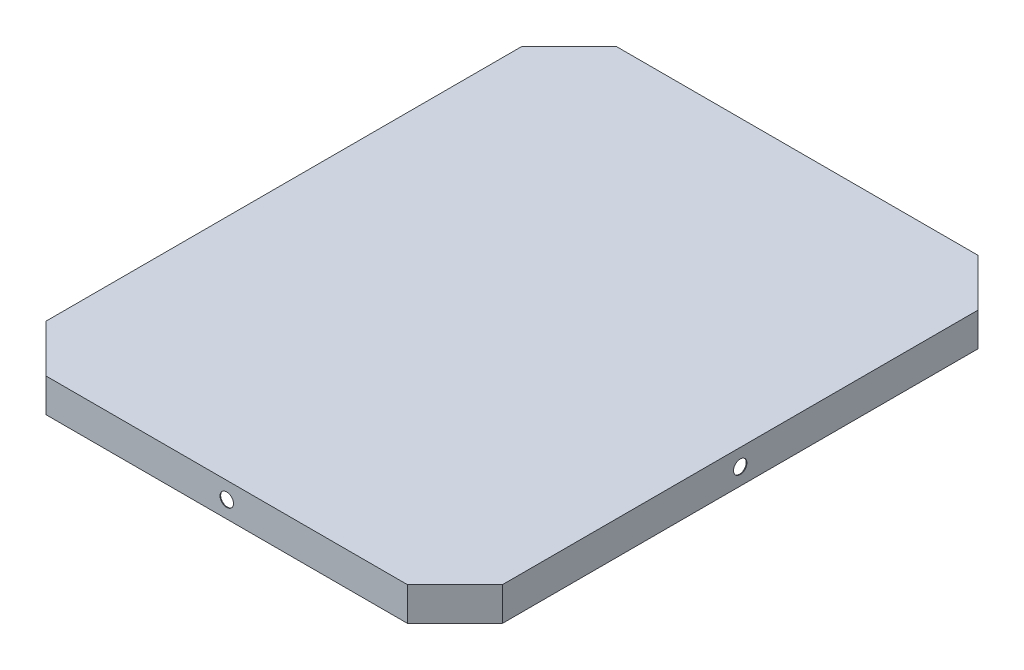
ISO-10303-21;
HEADER;
FILE_DESCRIPTION(('STEP AP214'),'2;1');
FILE_NAME('part.step','',(''),(''),'','','');
FILE_SCHEMA(('AUTOMOTIVE_DESIGN { 1 0 10303 214 1 1 1 1 }'));
ENDSEC;
DATA;
#1=APPLICATION_CONTEXT('core data for automotive mechanical design processes');
#2=APPLICATION_PROTOCOL_DEFINITION('international standard','automotive_design',2000,#1);
#3=PRODUCT_CONTEXT('',#1,'mechanical');
#4=PRODUCT('Part','Part','',(#3));
#5=PRODUCT_RELATED_PRODUCT_CATEGORY('part','',(#4));
#6=PRODUCT_DEFINITION_FORMATION('','',#4);
#7=PRODUCT_DEFINITION_CONTEXT('part definition',#1,'design');
#8=PRODUCT_DEFINITION('design','',#6,#7);
#9=PRODUCT_DEFINITION_SHAPE('','',#8);
#10=(LENGTH_UNIT() NAMED_UNIT(*) SI_UNIT(.MILLI.,.METRE.));
#11=(NAMED_UNIT(*) PLANE_ANGLE_UNIT() SI_UNIT($,.RADIAN.));
#12=(NAMED_UNIT(*) SI_UNIT($,.STERADIAN.) SOLID_ANGLE_UNIT());
#13=UNCERTAINTY_MEASURE_WITH_UNIT(LENGTH_MEASURE(1.E-05),#10,'distance_accuracy_value','');
#14=(GEOMETRIC_REPRESENTATION_CONTEXT(3) GLOBAL_UNCERTAINTY_ASSIGNED_CONTEXT((#13)) GLOBAL_UNIT_ASSIGNED_CONTEXT((#10,
#11,#12)) REPRESENTATION_CONTEXT('',''));
#15=CARTESIAN_POINT('',(0.,0.,0.));
#16=DIRECTION('',(0.,0.,1.));
#17=DIRECTION('',(1.,0.,0.));
#18=AXIS2_PLACEMENT_3D('',#15,#16,#17);
#19=CARTESIAN_POINT('',(581.519515408415,-1.,881.354272588105));
#20=DIRECTION('',(0.7071,0.,0.707113562308064));
#21=DIRECTION('',(0.707113562308064,0.,-0.7071));
#22=AXIS2_PLACEMENT_3D('',#19,#20,#21);
#23=PLANE('',#22);
#24=DIRECTION('',(0.707113562308064,0.,-0.7071));
#25=VECTOR('',#24,1.);
#26=CARTESIAN_POINT('',(278.576496757288,-50.,1184.29148084786));
#27=LINE('',#26,#25);
#28=CARTESIAN_POINT('',(583.519553768783,-50.,879.354272588105));
#29=VERTEX_POINT('',#28);
#30=CARTESIAN_POINT('',(653.645117944282,-50.,809.230053408029));
#31=VERTEX_POINT('',#30);
#32=EDGE_CURVE('E51',#29,#31,#27,.T.);
#33=ORIENTED_EDGE('',*,*,#32,.F.);
#34=DIRECTION('',(0.,1.,0.));
#35=VECTOR('',#34,1.);
#36=CARTESIAN_POINT('',(583.519553768783,-1.,879.354272588105));
#37=LINE('',#36,#35);
#38=CARTESIAN_POINT('',(583.519553768783,-1.,879.354272588105));
#39=VERTEX_POINT('',#38);
#40=EDGE_CURVE('E46',#29,#39,#37,.T.);
#41=ORIENTED_EDGE('',*,*,#40,.T.);
#42=DIRECTION('',(-0.707113562308064,0.,0.7071));
#43=VECTOR('',#42,1.);
#44=CARTESIAN_POINT('',(581.519515408415,-1.,881.354272588105));
#45=LINE('',#44,#43);
#46=CARTESIAN_POINT('',(653.645117944282,-1.,809.230053408029));
#47=VERTEX_POINT('',#46);
#48=EDGE_CURVE('E177',#47,#39,#45,.T.);
#49=ORIENTED_EDGE('',*,*,#48,.F.);
#50=DIRECTION('',(0.,1.,0.));
#51=VECTOR('',#50,1.);
#52=CARTESIAN_POINT('',(653.645117944282,-1.,809.230053408029));
#53=LINE('',#52,#51);
#54=EDGE_CURVE('E173',#31,#47,#53,.T.);
#55=ORIENTED_EDGE('',*,*,#54,.F.);
#56=EDGE_LOOP('',(#33,#41,#49,#55));
#57=FACE_BOUND('',#56,.T.);
#58=ADVANCED_FACE('F30',(#57),#23,.F.);
#59=CARTESIAN_POINT('',(655.645117944282,-1.,103.478518893794));
#60=DIRECTION('',(0.707113562438127,0.,-0.707099999869934));
#61=DIRECTION('',(-0.707099999869934,0.,-0.707113562438127));
#62=AXIS2_PLACEMENT_3D('',#59,#60,#61);
#63=PLANE('',#62);
#64=DIRECTION('',(0.,-1.,0.));
#65=VECTOR('',#64,1.);
#66=CARTESIAN_POINT('',(653.645117944281,-1.,101.47848053269));
#67=LINE('',#66,#65);
#68=CARTESIAN_POINT('',(653.645117944281,-1.,101.47848053269));
#69=VERTEX_POINT('',#68);
#70=CARTESIAN_POINT('',(653.645117944281,-50.,101.47848053269));
#71=VERTEX_POINT('',#70);
#72=EDGE_CURVE('E279',#69,#71,#67,.T.);
#73=ORIENTED_EDGE('',*,*,#72,.F.);
#74=DIRECTION('',(0.707099999869934,0.,0.707113562438127));
#75=VECTOR('',#74,1.);
#76=CARTESIAN_POINT('',(655.645117944282,-1.,103.478518893794));
#77=LINE('',#76,#75);
#78=CARTESIAN_POINT('',(583.520898777104,-1.,31.3529163442925));
#79=VERTEX_POINT('',#78);
#80=EDGE_CURVE('E163',#79,#69,#77,.T.);
#81=ORIENTED_EDGE('',*,*,#80,.F.);
#82=DIRECTION('',(0.,-1.,0.));
#83=VECTOR('',#82,1.);
#84=CARTESIAN_POINT('',(583.520898777104,-1.,31.3529163442925));
#85=LINE('',#84,#83);
#86=CARTESIAN_POINT('',(583.520898777104,-50.,31.3529163442925));
#87=VERTEX_POINT('',#86);
#88=EDGE_CURVE('E153',#79,#87,#85,.T.);
#89=ORIENTED_EDGE('',*,*,#88,.T.);
#90=DIRECTION('',(0.707099999869934,0.,0.707113562438127));
#91=VECTOR('',#90,1.);
#92=CARTESIAN_POINT('',(655.645117944282,-50.,103.478518893794));
#93=LINE('',#92,#91);
#94=EDGE_CURVE('E170',#87,#71,#93,.T.);
#95=ORIENTED_EDGE('',*,*,#94,.T.);
#96=EDGE_LOOP('',(#73,#81,#89,#95));
#97=FACE_BOUND('',#96,.T.);
#98=ADVANCED_FACE('F322',(#97),#63,.F.);
#99=CARTESIAN_POINT('',(314.65094752898,-1.,-237.522191977866));
#100=DIRECTION('',(0.,1.,0.));
#101=DIRECTION('',(0.,0.,1.));
#102=AXIS2_PLACEMENT_3D('',#99,#100,#101);
#103=PLANE('',#102);
#104=ORIENTED_EDGE('',*,*,#48,.T.);
#105=DIRECTION('',(-1.,0.,0.));
#106=VECTOR('',#105,1.);
#107=CARTESIAN_POINT('',(314.65094752898,-1.,879.354272588105));
#108=LINE('',#107,#106);
#109=CARTESIAN_POINT('',(45.7706821327865,-1.,879.354272588105));
#110=VERTEX_POINT('',#109);
#111=EDGE_CURVE('E285',#39,#110,#108,.T.);
#112=ORIENTED_EDGE('',*,*,#111,.T.);
#113=DIRECTION('',(-0.707113562308064,0.,-0.7071));
#114=VECTOR('',#113,1.);
#115=CARTESIAN_POINT('',(-24.3548820427121,-1.,809.230053408029));
#116=LINE('',#115,#114);
#117=CARTESIAN_POINT('',(-24.3548820427121,-1.,809.230053408029));
#118=VERTEX_POINT('',#117);
#119=EDGE_CURVE('E179',#110,#118,#116,.T.);
#120=ORIENTED_EDGE('',*,*,#119,.T.);
#121=DIRECTION('',(0.,0.,-1.));
#122=VECTOR('',#121,1.);
#123=CARTESIAN_POINT('',(-24.3548820427121,-1.,101.477135524369));
#124=LINE('',#123,#122);
#125=CARTESIAN_POINT('',(-24.3548820427121,-1.,101.477135524369));
#126=VERTEX_POINT('',#125);
#127=EDGE_CURVE('E154',#118,#126,#124,.T.);
#128=ORIENTED_EDGE('',*,*,#127,.T.);
#129=DIRECTION('',(0.707113562308064,0.,-0.7071));
#130=VECTOR('',#129,1.);
#131=CARTESIAN_POINT('',(-24.3548820427121,-1.,101.477135524369));
#132=LINE('',#131,#130);
#133=CARTESIAN_POINT('',(45.7706821327867,-1.,31.3529163442924));
#134=VERTEX_POINT('',#133);
#135=EDGE_CURVE('E146',#126,#134,#132,.T.);
#136=ORIENTED_EDGE('',*,*,#135,.T.);
#137=DIRECTION('',(1.,0.,0.));
#138=VECTOR('',#137,1.);
#139=CARTESIAN_POINT('',(583.520898777104,-1.,31.3529163442925));
#140=LINE('',#139,#138);
#141=EDGE_CURVE('E157',#134,#79,#140,.T.);
#142=ORIENTED_EDGE('',*,*,#141,.T.);
#143=ORIENTED_EDGE('',*,*,#80,.T.);
#144=DIRECTION('',(0.,0.,-1.));
#145=VECTOR('',#144,1.);
#146=CARTESIAN_POINT('',(653.645117944281,-1.,-237.522191977866));
#147=LINE('',#146,#145);
#148=EDGE_CURVE('E39',#47,#69,#147,.T.);
#149=ORIENTED_EDGE('',*,*,#148,.F.);
#150=EDGE_LOOP('',(#104,#112,#120,#128,#136,#142,#143,#149));
#151=FACE_BOUND('',#150,.T.);
#152=ADVANCED_FACE('F165',(#151),#103,.F.);
#153=CARTESIAN_POINT('',(-25.3548820427121,-50.,101.062916344292));
#154=DIRECTION('',(-1.,0.,0.));
#155=DIRECTION('',(0.,0.,1.));
#156=AXIS2_PLACEMENT_3D('',#153,#154,#155);
#157=PLANE('',#156);
#158=CARTESIAN_POINT('',(-25.354882042712,-25.,455.354272588105));
#159=DIRECTION('',(-1.,0.,0.));
#160=DIRECTION('',(0.,0.,1.));
#161=AXIS2_PLACEMENT_3D('',#158,#159,#160);
#162=CIRCLE('',#161,9.99999999999998);
#163=CARTESIAN_POINT('',(-25.354882042712,-25.,465.354272588105));
#164=VERTEX_POINT('',#163);
#165=EDGE_CURVE('E193',#164,#164,#162,.T.);
#166=ORIENTED_EDGE('',*,*,#165,.F.);
#167=EDGE_LOOP('',(#166));
#168=FACE_BOUND('',#167,.T.);
#169=DIRECTION('',(0.,0.,1.));
#170=VECTOR('',#169,1.);
#171=CARTESIAN_POINT('',(-25.3548820427121,0.,101.062916344292));
#172=LINE('',#171,#170);
#173=CARTESIAN_POINT('',(-25.3548820427121,0.,101.062916344292));
#174=VERTEX_POINT('',#173);
#175=CARTESIAN_POINT('',(-25.354882042712,0.,809.644272588105));
#176=VERTEX_POINT('',#175);
#177=EDGE_CURVE('E200',#174,#176,#172,.T.);
#178=ORIENTED_EDGE('',*,*,#177,.F.);
#179=DIRECTION('',(0.,1.,0.));
#180=VECTOR('',#179,1.);
#181=CARTESIAN_POINT('',(-25.3548820427121,-50.,101.062916344292));
#182=LINE('',#181,#180);
#183=CARTESIAN_POINT('',(-25.3548820427121,-50.,101.062916344292));
#184=VERTEX_POINT('',#183);
#185=EDGE_CURVE('E247',#184,#174,#182,.T.);
#186=ORIENTED_EDGE('',*,*,#185,.F.);
#187=DIRECTION('',(0.,0.,1.));
#188=VECTOR('',#187,1.);
#189=CARTESIAN_POINT('',(-25.3548820427121,-50.,101.062916344292));
#190=LINE('',#189,#188);
#191=CARTESIAN_POINT('',(-25.354882042712,-50.,809.644272588105));
#192=VERTEX_POINT('',#191);
#193=EDGE_CURVE('E201',#184,#192,#190,.T.);
#194=ORIENTED_EDGE('',*,*,#193,.T.);
#195=DIRECTION('',(0.,1.,0.));
#196=VECTOR('',#195,1.);
#197=CARTESIAN_POINT('',(-25.354882042712,-50.,809.644272588105));
#198=LINE('',#197,#196);
#199=EDGE_CURVE('E224',#192,#176,#198,.T.);
#200=ORIENTED_EDGE('',*,*,#199,.T.);
#201=EDGE_LOOP('',(#178,#186,#194,#200));
#202=FACE_BOUND('',#201,.T.);
#203=ADVANCED_FACE('F32',(#168,#202),#157,.T.);
#204=CARTESIAN_POINT('',(-25.3548820427121,-50.,101.062916344292));
#205=DIRECTION('',(-0.7071,0.,-0.707113562308064));
#206=DIRECTION('',(-0.707113562308064,0.,0.7071));
#207=AXIS2_PLACEMENT_3D('',#204,#205,#206);
#208=PLANE('',#207);
#209=DIRECTION('',(-0.707113562308064,0.,0.7071));
#210=VECTOR('',#209,1.);
#211=CARTESIAN_POINT('',(-25.3548820427121,0.,101.062916344292));
#212=LINE('',#211,#210);
#213=CARTESIAN_POINT('',(45.3564741880943,0.,30.3529163442925));
#214=VERTEX_POINT('',#213);
#215=EDGE_CURVE('E205',#214,#174,#212,.T.);
#216=ORIENTED_EDGE('',*,*,#215,.F.);
#217=DIRECTION('',(0.,1.,0.));
#218=VECTOR('',#217,1.);
#219=CARTESIAN_POINT('',(45.3564741880943,-50.,30.3529163442925));
#220=LINE('',#219,#218);
#221=CARTESIAN_POINT('',(45.3564741880943,-50.,30.3529163442925));
#222=VERTEX_POINT('',#221);
#223=EDGE_CURVE('E250',#222,#214,#220,.T.);
#224=ORIENTED_EDGE('',*,*,#223,.F.);
#225=DIRECTION('',(-0.707113562308064,0.,0.7071));
#226=VECTOR('',#225,1.);
#227=CARTESIAN_POINT('',(-25.3548820427121,-50.,101.062916344292));
#228=LINE('',#227,#226);
#229=EDGE_CURVE('E221',#222,#184,#228,.T.);
#230=ORIENTED_EDGE('',*,*,#229,.T.);
#231=ORIENTED_EDGE('',*,*,#185,.T.);
#232=EDGE_LOOP('',(#216,#224,#230,#231));
#233=FACE_BOUND('',#232,.T.);
#234=ADVANCED_FACE('F355',(#233),#208,.T.);
#235=CARTESIAN_POINT('',(45.3564741880943,-50.,30.3529163442925));
#236=DIRECTION('',(0.,0.,-1.));
#237=DIRECTION('',(-1.,0.,0.));
#238=AXIS2_PLACEMENT_3D('',#235,#236,#237);
#239=PLANE('',#238);
#240=CARTESIAN_POINT('',(314.645117950785,-25.,30.3529163442925));
#241=DIRECTION('',(0.,0.,-1.));
#242=DIRECTION('',(-1.,0.,0.));
#243=AXIS2_PLACEMENT_3D('',#240,#241,#242);
#244=CIRCLE('',#243,9.99999999999998);
#245=CARTESIAN_POINT('',(324.645117950785,-25.,30.3529163442925));
#246=VERTEX_POINT('',#245);
#247=EDGE_CURVE('E196',#246,#246,#244,.T.);
#248=ORIENTED_EDGE('',*,*,#247,.F.);
#249=EDGE_LOOP('',(#248));
#250=FACE_BOUND('',#249,.T.);
#251=DIRECTION('',(-1.,0.,0.));
#252=VECTOR('',#251,1.);
#253=CARTESIAN_POINT('',(45.3564741880943,0.,30.3529163442925));
#254=LINE('',#253,#252);
#255=CARTESIAN_POINT('',(583.935117957288,0.,30.3529163442925));
#256=VERTEX_POINT('',#255);
#257=EDGE_CURVE('E242',#256,#214,#254,.T.);
#258=ORIENTED_EDGE('',*,*,#257,.F.);
#259=DIRECTION('',(0.,1.,0.));
#260=VECTOR('',#259,1.);
#261=CARTESIAN_POINT('',(583.935117957288,-50.,30.3529163442925));
#262=LINE('',#261,#260);
#263=CARTESIAN_POINT('',(583.935117957288,-50.,30.3529163442925));
#264=VERTEX_POINT('',#263);
#265=EDGE_CURVE('E252',#264,#256,#262,.T.);
#266=ORIENTED_EDGE('',*,*,#265,.F.);
#267=DIRECTION('',(-1.,0.,0.));
#268=VECTOR('',#267,1.);
#269=CARTESIAN_POINT('',(45.3564741880943,-50.,30.3529163442925));
#270=LINE('',#269,#268);
#271=EDGE_CURVE('E218',#264,#222,#270,.T.);
#272=ORIENTED_EDGE('',*,*,#271,.T.);
#273=ORIENTED_EDGE('',*,*,#223,.T.);
#274=EDGE_LOOP('',(#258,#266,#272,#273));
#275=FACE_BOUND('',#274,.T.);
#276=ADVANCED_FACE('F358',(#250,#275),#239,.T.);
#277=CARTESIAN_POINT('',(583.935117957288,-50.,30.3529163442925));
#278=DIRECTION('',(0.707113562438127,0.,-0.707099999869934));
#279=DIRECTION('',(-0.707099999869934,0.,-0.707113562438127));
#280=AXIS2_PLACEMENT_3D('',#277,#278,#279);
#281=PLANE('',#280);
#282=DIRECTION('',(-0.707099999869934,0.,-0.707113562438127));
#283=VECTOR('',#282,1.);
#284=CARTESIAN_POINT('',(583.935117957288,0.,30.3529163442925));
#285=LINE('',#284,#283);
#286=CARTESIAN_POINT('',(654.645117944281,0.,101.064272588105));
#287=VERTEX_POINT('',#286);
#288=EDGE_CURVE('E239',#287,#256,#285,.T.);
#289=ORIENTED_EDGE('',*,*,#288,.F.);
#290=DIRECTION('',(0.,1.,0.));
#291=VECTOR('',#290,1.);
#292=CARTESIAN_POINT('',(654.645117944281,-50.,101.064272588105));
#293=LINE('',#292,#291);
#294=CARTESIAN_POINT('',(654.645117944281,-50.,101.064272588105));
#295=VERTEX_POINT('',#294);
#296=EDGE_CURVE('E254',#295,#287,#293,.T.);
#297=ORIENTED_EDGE('',*,*,#296,.F.);
#298=DIRECTION('',(-0.707099999869934,0.,-0.707113562438127));
#299=VECTOR('',#298,1.);
#300=CARTESIAN_POINT('',(583.935117957288,-50.,30.3529163442925));
#301=LINE('',#300,#299);
#302=EDGE_CURVE('E215',#295,#264,#301,.T.);
#303=ORIENTED_EDGE('',*,*,#302,.T.);
#304=ORIENTED_EDGE('',*,*,#265,.T.);
#305=EDGE_LOOP('',(#289,#297,#303,#304));
#306=FACE_BOUND('',#305,.T.);
#307=ADVANCED_FACE('F362',(#306),#281,.T.);
#308=CARTESIAN_POINT('',(654.645117944281,-50.,101.064272588105));
#309=DIRECTION('',(1.,0.,0.));
#310=DIRECTION('',(0.,0.,-1.));
#311=AXIS2_PLACEMENT_3D('',#308,#309,#310);
#312=PLANE('',#311);
#313=CARTESIAN_POINT('',(654.645117944282,-25.,455.354272588105));
#314=DIRECTION('',(1.,0.,0.));
#315=DIRECTION('',(0.,0.,-1.));
#316=AXIS2_PLACEMENT_3D('',#313,#314,#315);
#317=CIRCLE('',#316,9.99999999999998);
#318=CARTESIAN_POINT('',(654.645117944282,-25.,445.354272588105));
#319=VERTEX_POINT('',#318);
#320=EDGE_CURVE('E275',#319,#319,#317,.T.);
#321=ORIENTED_EDGE('',*,*,#320,.F.);
#322=EDGE_LOOP('',(#321));
#323=FACE_BOUND('',#322,.T.);
#324=DIRECTION('',(0.,0.,-1.));
#325=VECTOR('',#324,1.);
#326=CARTESIAN_POINT('',(654.645117944281,-50.,101.064272588105));
#327=LINE('',#326,#325);
#328=CARTESIAN_POINT('',(654.645117944282,-50.,809.644272588105));
#329=VERTEX_POINT('',#328);
#330=EDGE_CURVE('E213',#329,#295,#327,.T.);
#331=ORIENTED_EDGE('',*,*,#330,.T.);
#332=ORIENTED_EDGE('',*,*,#296,.T.);
#333=DIRECTION('',(0.,0.,-1.));
#334=VECTOR('',#333,1.);
#335=CARTESIAN_POINT('',(654.645117944281,0.,101.064272588105));
#336=LINE('',#335,#334);
#337=CARTESIAN_POINT('',(654.645117944282,0.,809.644272588105));
#338=VERTEX_POINT('',#337);
#339=EDGE_CURVE('E236',#338,#287,#336,.T.);
#340=ORIENTED_EDGE('',*,*,#339,.F.);
#341=DIRECTION('',(0.,1.,0.));
#342=VECTOR('',#341,1.);
#343=CARTESIAN_POINT('',(654.645117944282,-50.,809.644272588105));
#344=LINE('',#343,#342);
#345=EDGE_CURVE('E256',#329,#338,#344,.T.);
#346=ORIENTED_EDGE('',*,*,#345,.F.);
#347=EDGE_LOOP('',(#331,#332,#340,#346));
#348=FACE_BOUND('',#347,.T.);
#349=ADVANCED_FACE('F366',(#323,#348),#312,.T.);
#350=CARTESIAN_POINT('',(654.645117944282,-50.,809.644272588105));
#351=DIRECTION('',(0.7071,0.,0.707113562308064));
#352=DIRECTION('',(0.707113562308064,0.,-0.7071));
#353=AXIS2_PLACEMENT_3D('',#350,#351,#352);
#354=PLANE('',#353);
#355=DIRECTION('',(0.707113562308064,0.,-0.7071));
#356=VECTOR('',#355,1.);
#357=CARTESIAN_POINT('',(654.645117944282,0.,809.644272588105));
#358=LINE('',#357,#356);
#359=CARTESIAN_POINT('',(583.933761713475,0.,880.354272588105));
#360=VERTEX_POINT('',#359);
#361=EDGE_CURVE('E233',#360,#338,#358,.T.);
#362=ORIENTED_EDGE('',*,*,#361,.F.);
#363=DIRECTION('',(0.,1.,0.));
#364=VECTOR('',#363,1.);
#365=CARTESIAN_POINT('',(583.933761713475,-50.,880.354272588105));
#366=LINE('',#365,#364);
#367=CARTESIAN_POINT('',(583.933761713475,-50.,880.354272588105));
#368=VERTEX_POINT('',#367);
#369=EDGE_CURVE('E258',#368,#360,#366,.T.);
#370=ORIENTED_EDGE('',*,*,#369,.F.);
#371=DIRECTION('',(0.707113562308064,0.,-0.7071));
#372=VECTOR('',#371,1.);
#373=CARTESIAN_POINT('',(654.645117944282,-50.,809.644272588105));
#374=LINE('',#373,#372);
#375=EDGE_CURVE('E210',#368,#329,#374,.T.);
#376=ORIENTED_EDGE('',*,*,#375,.T.);
#377=ORIENTED_EDGE('',*,*,#345,.T.);
#378=EDGE_LOOP('',(#362,#370,#376,#377));
#379=FACE_BOUND('',#378,.T.);
#380=ADVANCED_FACE('F370',(#379),#354,.T.);
#381=CARTESIAN_POINT('',(45.3564741880943,-50.,880.354272588105));
#382=DIRECTION('',(0.,0.,1.));
#383=DIRECTION('',(1.,0.,0.));
#384=AXIS2_PLACEMENT_3D('',#381,#382,#383);
#385=PLANE('',#384);
#386=CARTESIAN_POINT('',(314.645117950785,-25.,880.354272588105));
#387=DIRECTION('',(0.,0.,1.));
#388=DIRECTION('',(1.,0.,0.));
#389=AXIS2_PLACEMENT_3D('',#386,#387,#388);
#390=CIRCLE('',#389,9.99999999999998);
#391=CARTESIAN_POINT('',(324.645117950785,-25.,880.354272588105));
#392=VERTEX_POINT('',#391);
#393=EDGE_CURVE('E303',#392,#392,#390,.T.);
#394=ORIENTED_EDGE('',*,*,#393,.F.);
#395=EDGE_LOOP('',(#394));
#396=FACE_BOUND('',#395,.T.);
#397=DIRECTION('',(1.,0.,0.));
#398=VECTOR('',#397,1.);
#399=CARTESIAN_POINT('',(45.3564741880943,-50.,880.354272588105));
#400=LINE('',#399,#398);
#401=CARTESIAN_POINT('',(45.3564741880943,-50.,880.354272588105));
#402=VERTEX_POINT('',#401);
#403=EDGE_CURVE('E208',#402,#368,#400,.T.);
#404=ORIENTED_EDGE('',*,*,#403,.T.);
#405=ORIENTED_EDGE('',*,*,#369,.T.);
#406=DIRECTION('',(1.,0.,0.));
#407=VECTOR('',#406,1.);
#408=CARTESIAN_POINT('',(45.3564741880943,0.,880.354272588105));
#409=LINE('',#408,#407);
#410=CARTESIAN_POINT('',(45.3564741880943,0.,880.354272588105));
#411=VERTEX_POINT('',#410);
#412=EDGE_CURVE('E230',#411,#360,#409,.T.);
#413=ORIENTED_EDGE('',*,*,#412,.F.);
#414=DIRECTION('',(0.,1.,0.));
#415=VECTOR('',#414,1.);
#416=CARTESIAN_POINT('',(45.3564741880943,-50.,880.354272588105));
#417=LINE('',#416,#415);
#418=EDGE_CURVE('E260',#402,#411,#417,.T.);
#419=ORIENTED_EDGE('',*,*,#418,.F.);
#420=EDGE_LOOP('',(#404,#405,#413,#419));
#421=FACE_BOUND('',#420,.T.);
#422=ADVANCED_FACE('F374',(#396,#421),#385,.T.);
#423=CARTESIAN_POINT('',(-25.354882042712,-50.,809.644272588105));
#424=DIRECTION('',(-0.707100000000001,0.,0.707113562308063));
#425=DIRECTION('',(0.707113562308063,0.,0.707100000000001));
#426=AXIS2_PLACEMENT_3D('',#423,#424,#425);
#427=PLANE('',#426);
#428=DIRECTION('',(0.707113562308063,0.,0.707100000000001));
#429=VECTOR('',#428,1.);
#430=CARTESIAN_POINT('',(-25.354882042712,0.,809.644272588105));
#431=LINE('',#430,#429);
#432=EDGE_CURVE('E227',#176,#411,#431,.T.);
#433=ORIENTED_EDGE('',*,*,#432,.F.);
#434=ORIENTED_EDGE('',*,*,#199,.F.);
#435=DIRECTION('',(0.707113562308063,0.,0.707100000000001));
#436=VECTOR('',#435,1.);
#437=CARTESIAN_POINT('',(-25.354882042712,-50.,809.644272588105));
#438=LINE('',#437,#436);
#439=EDGE_CURVE('E204',#192,#402,#438,.T.);
#440=ORIENTED_EDGE('',*,*,#439,.T.);
#441=ORIENTED_EDGE('',*,*,#418,.T.);
#442=EDGE_LOOP('',(#433,#434,#440,#441));
#443=FACE_BOUND('',#442,.T.);
#444=ADVANCED_FACE('F350',(#443),#427,.T.);
#445=CARTESIAN_POINT('',(-25.354882042712,-50.,880.354272588105));
#446=DIRECTION('',(0.,1.,0.));
#447=DIRECTION('',(0.,0.,1.));
#448=AXIS2_PLACEMENT_3D('',#445,#446,#447);
#449=PLANE('',#448);
#450=DIRECTION('',(1.,0.,0.));
#451=VECTOR('',#450,1.);
#452=CARTESIAN_POINT('',(583.933761713475,-50.,879.354272588105));
#453=LINE('',#452,#451);
#454=CARTESIAN_POINT('',(45.7706821327866,-50.,879.354272588105));
#455=VERTEX_POINT('',#454);
#456=EDGE_CURVE('E300',#455,#29,#453,.T.);
#457=ORIENTED_EDGE('',*,*,#456,.T.);
#458=ORIENTED_EDGE('',*,*,#32,.T.);
#459=DIRECTION('',(0.,0.,-1.));
#460=VECTOR('',#459,1.);
#461=CARTESIAN_POINT('',(653.645117944282,-50.,809.644272588105));
#462=LINE('',#461,#460);
#463=EDGE_CURVE('E274',#31,#71,#462,.T.);
#464=ORIENTED_EDGE('',*,*,#463,.T.);
#465=ORIENTED_EDGE('',*,*,#94,.F.);
#466=DIRECTION('',(1.,0.,0.));
#467=VECTOR('',#466,1.);
#468=CARTESIAN_POINT('',(583.520898777104,-50.,31.3529163442925));
#469=LINE('',#468,#467);
#470=CARTESIAN_POINT('',(45.7706821327867,-50.,31.3529163442924));
#471=VERTEX_POINT('',#470);
#472=EDGE_CURVE('E183',#471,#87,#469,.T.);
#473=ORIENTED_EDGE('',*,*,#472,.F.);
#474=DIRECTION('',(0.707113562308064,0.,-0.7071));
#475=VECTOR('',#474,1.);
#476=CARTESIAN_POINT('',(-24.3548820427121,-50.,101.477135524369));
#477=LINE('',#476,#475);
#478=CARTESIAN_POINT('',(-24.3548820427121,-50.,101.477135524369));
#479=VERTEX_POINT('',#478);
#480=EDGE_CURVE('E149',#479,#471,#477,.T.);
#481=ORIENTED_EDGE('',*,*,#480,.F.);
#482=DIRECTION('',(0.,0.,-1.));
#483=VECTOR('',#482,1.);
#484=CARTESIAN_POINT('',(-24.3548820427121,-50.,101.477135524369));
#485=LINE('',#484,#483);
#486=CARTESIAN_POINT('',(-24.3548820427121,-50.,809.230053408029));
#487=VERTEX_POINT('',#486);
#488=EDGE_CURVE('E167',#487,#479,#485,.T.);
#489=ORIENTED_EDGE('',*,*,#488,.F.);
#490=DIRECTION('',(0.707113562308064,0.,0.7071));
#491=VECTOR('',#490,1.);
#492=CARTESIAN_POINT('',(10.7072179507849,-50.,844.291480916897));
#493=LINE('',#492,#491);
#494=EDGE_CURVE('E249',#487,#455,#493,.T.);
#495=ORIENTED_EDGE('',*,*,#494,.T.);
#496=EDGE_LOOP('',(#457,#458,#464,#465,#473,#481,#489,#495));
#497=FACE_BOUND('',#496,.T.);
#498=ORIENTED_EDGE('',*,*,#403,.F.);
#499=ORIENTED_EDGE('',*,*,#439,.F.);
#500=ORIENTED_EDGE('',*,*,#193,.F.);
#501=ORIENTED_EDGE('',*,*,#229,.F.);
#502=ORIENTED_EDGE('',*,*,#271,.F.);
#503=ORIENTED_EDGE('',*,*,#302,.F.);
#504=ORIENTED_EDGE('',*,*,#330,.F.);
#505=ORIENTED_EDGE('',*,*,#375,.F.);
#506=EDGE_LOOP('',(#498,#499,#500,#501,#502,#503,#504,#505));
#507=FACE_BOUND('',#506,.T.);
#508=ADVANCED_FACE('F347',(#497,#507),#449,.F.);
#509=CARTESIAN_POINT('',(-25.354882042712,0.,880.354272588105));
#510=DIRECTION('',(0.,1.,0.));
#511=DIRECTION('',(0.,0.,1.));
#512=AXIS2_PLACEMENT_3D('',#509,#510,#511);
#513=PLANE('',#512);
#514=ORIENTED_EDGE('',*,*,#432,.T.);
#515=ORIENTED_EDGE('',*,*,#412,.T.);
#516=ORIENTED_EDGE('',*,*,#361,.T.);
#517=ORIENTED_EDGE('',*,*,#339,.T.);
#518=ORIENTED_EDGE('',*,*,#288,.T.);
#519=ORIENTED_EDGE('',*,*,#257,.T.);
#520=ORIENTED_EDGE('',*,*,#215,.T.);
#521=ORIENTED_EDGE('',*,*,#177,.T.);
#522=EDGE_LOOP('',(#514,#515,#516,#517,#518,#519,#520,#521));
#523=FACE_BOUND('',#522,.T.);
#524=ADVANCED_FACE('F345',(#523),#513,.T.);
#525=CARTESIAN_POINT('',(314.645117950785,-25.,25.3542725881053));
#526=DIRECTION('',(0.,0.,1.));
#527=DIRECTION('',(1.,0.,0.));
#528=AXIS2_PLACEMENT_3D('',#525,#526,#527);
#529=CYLINDRICAL_SURFACE('',#528,9.99999999999998);
#530=CARTESIAN_POINT('',(314.645117950785,-25.,31.3529163442925));
#531=DIRECTION('',(0.,0.,-1.));
#532=DIRECTION('',(-1.,0.,0.));
#533=AXIS2_PLACEMENT_3D('',#530,#531,#532);
#534=CIRCLE('',#533,9.99999999999998);
#535=CARTESIAN_POINT('',(324.645117950785,-25.,31.3529163442925));
#536=VERTEX_POINT('',#535);
#537=EDGE_CURVE('E197',#536,#536,#534,.F.);
#538=CARTESIAN_POINT('',(324.645117950785,-25.,31.3529163442925));
#539=CARTESIAN_POINT('',(324.645117950785,-25.,31.3424996776258));
#540=CARTESIAN_POINT('',(324.645117950785,-25.,31.3320830109591));
#541=CARTESIAN_POINT('',(324.645117950785,-25.,31.3112496776258));
#542=CARTESIAN_POINT('',(324.645117950785,-25.,31.3008330109591));
#543=CARTESIAN_POINT('',(324.645117950785,-25.,31.2799996776258));
#544=CARTESIAN_POINT('',(324.645117950785,-25.,31.2695830109591));
#545=CARTESIAN_POINT('',(324.645117950785,-25.,31.2487496776258));
#546=CARTESIAN_POINT('',(324.645117950785,-25.,31.2383330109591));
#547=CARTESIAN_POINT('',(324.645117950785,-25.,31.2174996776258));
#548=CARTESIAN_POINT('',(324.645117950785,-25.,31.2070830109591));
#549=CARTESIAN_POINT('',(324.645117950785,-25.,31.1862496776258));
#550=CARTESIAN_POINT('',(324.645117950785,-25.,31.1758330109591));
#551=CARTESIAN_POINT('',(324.645117950785,-25.,31.1549996776258));
#552=CARTESIAN_POINT('',(324.645117950785,-25.,31.1445830109591));
#553=CARTESIAN_POINT('',(324.645117950785,-25.,31.1237496776258));
#554=CARTESIAN_POINT('',(324.645117950785,-25.,31.1133330109591));
#555=CARTESIAN_POINT('',(324.645117950785,-25.,31.0924996776258));
#556=CARTESIAN_POINT('',(324.645117950785,-25.,31.0820830109591));
#557=CARTESIAN_POINT('',(324.645117950785,-25.,31.0612496776258));
#558=CARTESIAN_POINT('',(324.645117950785,-25.,31.0508330109591));
#559=CARTESIAN_POINT('',(324.645117950785,-25.,31.0299996776258));
#560=CARTESIAN_POINT('',(324.645117950785,-25.,31.0195830109591));
#561=CARTESIAN_POINT('',(324.645117950785,-25.,30.9987496776258));
#562=CARTESIAN_POINT('',(324.645117950785,-25.,30.9883330109591));
#563=CARTESIAN_POINT('',(324.645117950785,-25.,30.9674996776258));
#564=CARTESIAN_POINT('',(324.645117950785,-25.,30.9570830109591));
#565=CARTESIAN_POINT('',(324.645117950785,-25.,30.9362496776258));
#566=CARTESIAN_POINT('',(324.645117950785,-25.,30.9258330109591));
#567=CARTESIAN_POINT('',(324.645117950785,-25.,30.9049996776258));
#568=CARTESIAN_POINT('',(324.645117950785,-25.,30.8945830109592));
#569=CARTESIAN_POINT('',(324.645117950785,-25.,30.8737496776258));
#570=CARTESIAN_POINT('',(324.645117950785,-25.,30.8633330109592));
#571=CARTESIAN_POINT('',(324.645117950785,-25.,30.8424996776258));
#572=CARTESIAN_POINT('',(324.645117950785,-25.,30.8320830109592));
#573=CARTESIAN_POINT('',(324.645117950785,-25.,30.8112496776258));
#574=CARTESIAN_POINT('',(324.645117950785,-25.,30.8008330109592));
#575=CARTESIAN_POINT('',(324.645117950785,-25.,30.7799996776258));
#576=CARTESIAN_POINT('',(324.645117950785,-25.,30.7695830109592));
#577=CARTESIAN_POINT('',(324.645117950785,-25.,30.7487496776258));
#578=CARTESIAN_POINT('',(324.645117950785,-25.,30.7383330109592));
#579=CARTESIAN_POINT('',(324.645117950785,-25.,30.7174996776258));
#580=CARTESIAN_POINT('',(324.645117950785,-25.,30.7070830109592));
#581=CARTESIAN_POINT('',(324.645117950785,-25.,30.6862496776258));
#582=CARTESIAN_POINT('',(324.645117950785,-25.,30.6758330109592));
#583=CARTESIAN_POINT('',(324.645117950785,-25.,30.6549996776258));
#584=CARTESIAN_POINT('',(324.645117950785,-25.,30.6445830109592));
#585=CARTESIAN_POINT('',(324.645117950785,-25.,30.6237496776258));
#586=CARTESIAN_POINT('',(324.645117950785,-25.,30.6133330109592));
#587=CARTESIAN_POINT('',(324.645117950785,-25.,30.5924996776258));
#588=CARTESIAN_POINT('',(324.645117950785,-25.,30.5820830109592));
#589=CARTESIAN_POINT('',(324.645117950785,-25.,30.5612496776258));
#590=CARTESIAN_POINT('',(324.645117950785,-25.,30.5508330109592));
#591=CARTESIAN_POINT('',(324.645117950785,-25.,30.5299996776258));
#592=CARTESIAN_POINT('',(324.645117950785,-25.,30.5195830109592));
#593=CARTESIAN_POINT('',(324.645117950785,-25.,30.4987496776258));
#594=CARTESIAN_POINT('',(324.645117950785,-25.,30.4883330109592));
#595=CARTESIAN_POINT('',(324.645117950785,-25.,30.4674996776258));
#596=CARTESIAN_POINT('',(324.645117950785,-25.,30.4570830109592));
#597=CARTESIAN_POINT('',(324.645117950785,-25.,30.4362496776258));
#598=CARTESIAN_POINT('',(324.645117950785,-25.,30.4258330109592));
#599=CARTESIAN_POINT('',(324.645117950785,-25.,30.4049996776258));
#600=CARTESIAN_POINT('',(324.645117950785,-25.,30.3945830109592));
#601=CARTESIAN_POINT('',(324.645117950785,-25.,30.3737496776258));
#602=CARTESIAN_POINT('',(324.645117950785,-25.,30.3633330109592));
#603=CARTESIAN_POINT('',(324.645117950785,-25.,30.3529163442925));
#604=B_SPLINE_CURVE_WITH_KNOTS('',3,(#538,#539,#540,#541,#542,#543,#544,#545,#546,#547,#548,
#549,#550,#551,#552,#553,#554,#555,#556,#557,#558,#559,#560,#561,#562,#563,#564,#565,#566,#567,
#568,#569,#570,#571,#572,#573,#574,#575,#576,#577,#578,#579,#580,#581,#582,#583,#584,#585,#586,
#587,#588,#589,#590,#591,#592,#593,#594,#595,#596,#597,#598,#599,#600,#601,#602,#603),
.UNSPECIFIED.,.F.,.F.,(4,2,2,2,2,2,2,2,2,2,2,2,2,2,2,2,2,2,2,2,2,2,2,2,2,2,2,2,2,2,2,2,4),(0.,
0.0312499999999966,0.0624999999999931,0.0937499999999966,0.124999999999993,0.156249999999993,
0.187499999999993,0.21874999999999,0.24999999999999,0.28124999999999,0.312499999999986,
0.343749999999986,0.374999999999986,0.406249999999986,0.437499999999987,0.468749999999983,
0.499999999999983,0.531249999999983,0.56249999999998,0.59374999999998,0.62499999999998,
0.65624999999998,0.68749999999998,0.718749999999976,0.749999999999976,0.781249999999976,
0.812499999999973,0.843749999999973,0.874999999999973,0.90624999999997,0.93749999999997,
0.96874999999997,0.99999999999997),.UNSPECIFIED.);
#605=EDGE_CURVE('BSEAM341',#536,#246,#604,.T.);
#606=ORIENTED_EDGE('',*,*,#537,.T.);
#607=ORIENTED_EDGE('',*,*,#247,.T.);
#608=ORIENTED_EDGE('',*,*,#605,.T.);
#609=ORIENTED_EDGE('',*,*,#605,.F.);
#610=EDGE_LOOP('',(#606,#608,#607,#609));
#611=FACE_BOUND('',#610,.T.);
#612=ADVANCED_FACE('F341',(#611),#529,.F.);
#613=CARTESIAN_POINT('',(-195.354882055718,-25.,455.354272588105));
#614=DIRECTION('',(1.,0.,0.));
#615=DIRECTION('',(0.,0.,-1.));
#616=AXIS2_PLACEMENT_3D('',#613,#614,#615);
#617=CYLINDRICAL_SURFACE('',#616,9.99999999999998);
#618=CARTESIAN_POINT('',(-24.3548820427121,-25.,455.354272588105));
#619=DIRECTION('',(-1.,0.,0.));
#620=DIRECTION('',(0.,0.,1.));
#621=AXIS2_PLACEMENT_3D('',#618,#619,#620);
#622=CIRCLE('',#621,9.99999999999998);
#623=CARTESIAN_POINT('',(-24.3548820427121,-25.,465.354272588105));
#624=VERTEX_POINT('',#623);
#625=EDGE_CURVE('E188',#624,#624,#622,.F.);
#626=ORIENTED_EDGE('',*,*,#625,.T.);
#627=EDGE_LOOP('',(#626));
#628=FACE_BOUND('',#627,.T.);
#629=ORIENTED_EDGE('',*,*,#165,.T.);
#630=EDGE_LOOP('',(#629));
#631=FACE_BOUND('',#630,.T.);
#632=ADVANCED_FACE('F336',(#628,#631),#617,.F.);
#633=CARTESIAN_POINT('',(583.520898777104,-1.,31.3529163442925));
#634=DIRECTION('',(0.,0.,-1.));
#635=DIRECTION('',(-1.,0.,0.));
#636=AXIS2_PLACEMENT_3D('',#633,#634,#635);
#637=PLANE('',#636);
#638=ORIENTED_EDGE('',*,*,#472,.T.);
#639=ORIENTED_EDGE('',*,*,#88,.F.);
#640=ORIENTED_EDGE('',*,*,#141,.F.);
#641=DIRECTION('',(0.,-1.,0.));
#642=VECTOR('',#641,1.);
#643=CARTESIAN_POINT('',(45.7706821327867,-1.,31.3529163442924));
#644=LINE('',#643,#642);
#645=EDGE_CURVE('E142',#134,#471,#644,.T.);
#646=ORIENTED_EDGE('',*,*,#645,.T.);
#647=EDGE_LOOP('',(#638,#639,#640,#646));
#648=FACE_BOUND('',#647,.T.);
#649=ORIENTED_EDGE('',*,*,#537,.F.);
#650=EDGE_LOOP('',(#649));
#651=FACE_BOUND('',#650,.T.);
#652=ADVANCED_FACE('F158',(#648,#651),#637,.F.);
#653=CARTESIAN_POINT('',(-24.3548820427121,-1.,101.477135524369));
#654=DIRECTION('',(-1.,0.,0.));
#655=DIRECTION('',(0.,0.,1.));
#656=AXIS2_PLACEMENT_3D('',#653,#654,#655);
#657=PLANE('',#656);
#658=ORIENTED_EDGE('',*,*,#488,.T.);
#659=DIRECTION('',(0.,-1.,0.));
#660=VECTOR('',#659,1.);
#661=CARTESIAN_POINT('',(-24.3548820427121,-1.,101.477135524369));
#662=LINE('',#661,#660);
#663=EDGE_CURVE('E186',#126,#479,#662,.T.);
#664=ORIENTED_EDGE('',*,*,#663,.F.);
#665=ORIENTED_EDGE('',*,*,#127,.F.);
#666=DIRECTION('',(0.,-1.,0.));
#667=VECTOR('',#666,1.);
#668=CARTESIAN_POINT('',(-24.3548820427121,-1.,809.230053408029));
#669=LINE('',#668,#667);
#670=EDGE_CURVE('E189',#118,#487,#669,.T.);
#671=ORIENTED_EDGE('',*,*,#670,.T.);
#672=EDGE_LOOP('',(#658,#664,#665,#671));
#673=FACE_BOUND('',#672,.T.);
#674=ORIENTED_EDGE('',*,*,#625,.F.);
#675=EDGE_LOOP('',(#674));
#676=FACE_BOUND('',#675,.T.);
#677=ADVANCED_FACE('F335',(#673,#676),#657,.F.);
#678=CARTESIAN_POINT('',(-24.3548820427121,-1.,101.477135524369));
#679=DIRECTION('',(-0.7071,0.,-0.707113562308064));
#680=DIRECTION('',(-0.707113562308064,0.,0.7071));
#681=AXIS2_PLACEMENT_3D('',#678,#679,#680);
#682=PLANE('',#681);
#683=ORIENTED_EDGE('',*,*,#480,.T.);
#684=ORIENTED_EDGE('',*,*,#645,.F.);
#685=ORIENTED_EDGE('',*,*,#135,.F.);
#686=ORIENTED_EDGE('',*,*,#663,.T.);
#687=EDGE_LOOP('',(#683,#684,#685,#686));
#688=FACE_BOUND('',#687,.T.);
#689=ADVANCED_FACE('F144',(#688),#682,.F.);
#690=CARTESIAN_POINT('',(-24.3548820427121,-1.,809.230053408029));
#691=DIRECTION('',(-0.7071,0.,0.707113562308064));
#692=DIRECTION('',(0.707113562308064,0.,0.7071));
#693=AXIS2_PLACEMENT_3D('',#690,#691,#692);
#694=PLANE('',#693);
#695=ORIENTED_EDGE('',*,*,#119,.F.);
#696=DIRECTION('',(0.,-1.,0.));
#697=VECTOR('',#696,1.);
#698=CARTESIAN_POINT('',(45.7706821327866,-1.,879.354272588105));
#699=LINE('',#698,#697);
#700=EDGE_CURVE('E11',#110,#455,#699,.T.);
#701=ORIENTED_EDGE('',*,*,#700,.T.);
#702=ORIENTED_EDGE('',*,*,#494,.F.);
#703=ORIENTED_EDGE('',*,*,#670,.F.);
#704=EDGE_LOOP('',(#695,#701,#702,#703));
#705=FACE_BOUND('',#704,.T.);
#706=ADVANCED_FACE('F330',(#705),#694,.F.);
#707=CARTESIAN_POINT('',(653.645117944282,-50.,809.644272588105));
#708=DIRECTION('',(1.,0.,0.));
#709=DIRECTION('',(0.,0.,-1.));
#710=AXIS2_PLACEMENT_3D('',#707,#708,#709);
#711=PLANE('',#710);
#712=CARTESIAN_POINT('',(653.645117944282,-25.,455.354272588105));
#713=DIRECTION('',(1.,0.,0.));
#714=DIRECTION('',(0.,0.,-1.));
#715=AXIS2_PLACEMENT_3D('',#712,#713,#714);
#716=CIRCLE('',#715,9.99999999999998);
#717=CARTESIAN_POINT('',(653.645117944282,-25.,445.354272588105));
#718=VERTEX_POINT('',#717);
#719=EDGE_CURVE('E272',#718,#718,#716,.T.);
#720=ORIENTED_EDGE('',*,*,#719,.T.);
#721=EDGE_LOOP('',(#720));
#722=FACE_BOUND('',#721,.T.);
#723=ORIENTED_EDGE('',*,*,#463,.F.);
#724=ORIENTED_EDGE('',*,*,#54,.T.);
#725=ORIENTED_EDGE('',*,*,#148,.T.);
#726=ORIENTED_EDGE('',*,*,#72,.T.);
#727=EDGE_LOOP('',(#723,#724,#725,#726));
#728=FACE_BOUND('',#727,.T.);
#729=ADVANCED_FACE('F292',(#722,#728),#711,.F.);
#730=CARTESIAN_POINT('',(649.645117944282,-25.,455.354272588105));
#731=DIRECTION('',(1.,0.,0.));
#732=DIRECTION('',(0.,0.,-1.));
#733=AXIS2_PLACEMENT_3D('',#730,#731,#732);
#734=CYLINDRICAL_SURFACE('',#733,9.99999999999998);
#735=ORIENTED_EDGE('',*,*,#320,.T.);
#736=EDGE_LOOP('',(#735));
#737=FACE_BOUND('',#736,.T.);
#738=ORIENTED_EDGE('',*,*,#719,.F.);
#739=EDGE_LOOP('',(#738));
#740=FACE_BOUND('',#739,.T.);
#741=ADVANCED_FACE('F313',(#737,#740),#734,.F.);
#742=CARTESIAN_POINT('',(583.933761713475,-50.,879.354272588105));
#743=DIRECTION('',(0.,0.,-1.));
#744=DIRECTION('',(-1.,0.,0.));
#745=AXIS2_PLACEMENT_3D('',#742,#743,#744);
#746=PLANE('',#745);
#747=CARTESIAN_POINT('',(314.645117950785,-25.,879.354272588105));
#748=DIRECTION('',(0.,0.,-1.));
#749=DIRECTION('',(-1.,0.,0.));
#750=AXIS2_PLACEMENT_3D('',#747,#748,#749);
#751=CIRCLE('',#750,9.99999999999998);
#752=CARTESIAN_POINT('',(304.645117950785,-25.,879.354272588105));
#753=VERTEX_POINT('',#752);
#754=EDGE_CURVE('E34',#753,#753,#751,.T.);
#755=ORIENTED_EDGE('',*,*,#754,.F.);
#756=EDGE_LOOP('',(#755));
#757=FACE_BOUND('',#756,.T.);
#758=ORIENTED_EDGE('',*,*,#40,.F.);
#759=ORIENTED_EDGE('',*,*,#456,.F.);
#760=ORIENTED_EDGE('',*,*,#700,.F.);
#761=ORIENTED_EDGE('',*,*,#111,.F.);
#762=EDGE_LOOP('',(#758,#759,#760,#761));
#763=FACE_BOUND('',#762,.T.);
#764=ADVANCED_FACE('F297',(#757,#763),#746,.T.);
#765=CARTESIAN_POINT('',(314.645117950785,-25.,875.354272588105));
#766=DIRECTION('',(0.,0.,1.));
#767=DIRECTION('',(1.,0.,0.));
#768=AXIS2_PLACEMENT_3D('',#765,#766,#767);
#769=CYLINDRICAL_SURFACE('',#768,9.99999999999998);
#770=ORIENTED_EDGE('',*,*,#754,.T.);
#771=EDGE_LOOP('',(#770));
#772=FACE_BOUND('',#771,.T.);
#773=ORIENTED_EDGE('',*,*,#393,.T.);
#774=EDGE_LOOP('',(#773));
#775=FACE_BOUND('',#774,.T.);
#776=ADVANCED_FACE('F310',(#772,#775),#769,.F.);
#777=CLOSED_SHELL('',(#58,#98,#152,#203,#234,#276,#307,#349,#380,#422,#444,#508,#524,#612,#632,
#652,#677,#689,#706,#729,#741,#764,#776));
#778=MANIFOLD_SOLID_BREP('B2',#777);
#779=ADVANCED_BREP_SHAPE_REPRESENTATION('',(#18,#778),#14);
#780=SHAPE_DEFINITION_REPRESENTATION(#9,#779);
ENDSEC;
END-ISO-10303-21;
